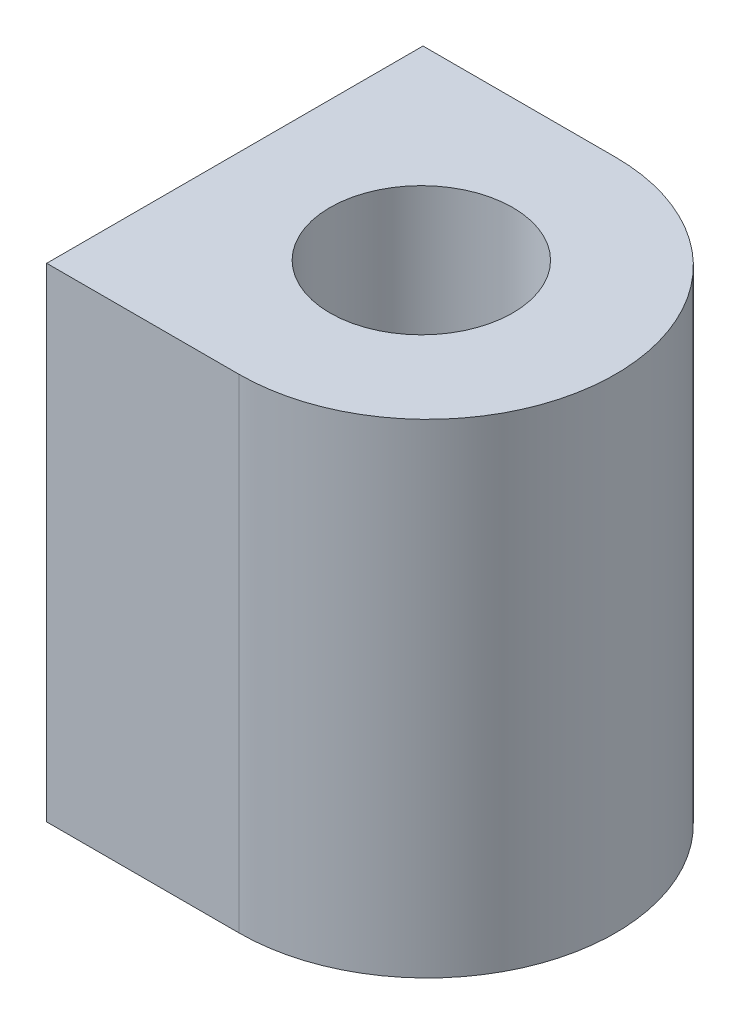
ISO-10303-21;
HEADER;
FILE_DESCRIPTION(('STEP AP214'),'2;1');
FILE_NAME('part.step','',(''),(''),'','','');
FILE_SCHEMA(('AUTOMOTIVE_DESIGN { 1 0 10303 214 1 1 1 1 }'));
ENDSEC;
DATA;
#1=APPLICATION_CONTEXT('core data for automotive mechanical design processes');
#2=APPLICATION_PROTOCOL_DEFINITION('international standard','automotive_design',2000,#1);
#3=PRODUCT_CONTEXT('',#1,'mechanical');
#4=PRODUCT('Part','Part','',(#3));
#5=PRODUCT_RELATED_PRODUCT_CATEGORY('part','',(#4));
#6=PRODUCT_DEFINITION_FORMATION('','',#4);
#7=PRODUCT_DEFINITION_CONTEXT('part definition',#1,'design');
#8=PRODUCT_DEFINITION('design','',#6,#7);
#9=PRODUCT_DEFINITION_SHAPE('','',#8);
#10=(LENGTH_UNIT() NAMED_UNIT(*) SI_UNIT(.MILLI.,.METRE.));
#11=(NAMED_UNIT(*) PLANE_ANGLE_UNIT() SI_UNIT($,.RADIAN.));
#12=(NAMED_UNIT(*) SI_UNIT($,.STERADIAN.) SOLID_ANGLE_UNIT());
#13=UNCERTAINTY_MEASURE_WITH_UNIT(LENGTH_MEASURE(1.E-05),#10,'distance_accuracy_value','');
#14=(GEOMETRIC_REPRESENTATION_CONTEXT(3) GLOBAL_UNCERTAINTY_ASSIGNED_CONTEXT((#13)) GLOBAL_UNIT_ASSIGNED_CONTEXT((#10,
#11,#12)) REPRESENTATION_CONTEXT('',''));
#15=CARTESIAN_POINT('',(0.,0.,0.));
#16=DIRECTION('',(0.,0.,1.));
#17=DIRECTION('',(1.,0.,0.));
#18=AXIS2_PLACEMENT_3D('',#15,#16,#17);
#19=CARTESIAN_POINT('',(0.143666225857325,9.,0.033363683393497));
#20=DIRECTION('',(0.,-1.,0.));
#21=DIRECTION('',(0.,0.,-1.));
#22=AXIS2_PLACEMENT_3D('',#19,#20,#21);
#23=PLANE('',#22);
#24=DIRECTION('',(0.,0.,1.));
#25=VECTOR('',#24,1.);
#26=CARTESIAN_POINT('',(-3.43579487814067,9.,0.033363683393497));
#27=LINE('',#26,#25);
#28=CARTESIAN_POINT('',(-3.43579487814067,9.,-3.4666363166065));
#29=VERTEX_POINT('',#28);
#30=CARTESIAN_POINT('',(-3.43579487814067,9.,3.5333636833935));
#31=VERTEX_POINT('',#30);
#32=EDGE_CURVE('E57',#29,#31,#27,.T.);
#33=ORIENTED_EDGE('',*,*,#32,.T.);
#34=DIRECTION('',(1.,0.,0.));
#35=VECTOR('',#34,1.);
#36=CARTESIAN_POINT('',(-3.43579487814067,9.,3.5333636833935));
#37=LINE('',#36,#35);
#38=CARTESIAN_POINT('',(0.143666225857325,9.,3.5333636833935));
#39=VERTEX_POINT('',#38);
#40=EDGE_CURVE('E88',#31,#39,#37,.T.);
#41=ORIENTED_EDGE('',*,*,#40,.T.);
#42=CARTESIAN_POINT('',(0.143666225857325,9.,0.033363683393497));
#43=DIRECTION('',(0.,1.,0.));
#44=DIRECTION('',(0.,0.,-1.));
#45=AXIS2_PLACEMENT_3D('',#42,#43,#44);
#46=CIRCLE('',#45,3.5);
#47=CARTESIAN_POINT('',(0.143666225857325,9.,-3.4666363166065));
#48=VERTEX_POINT('',#47);
#49=EDGE_CURVE('E92',#39,#48,#46,.T.);
#50=ORIENTED_EDGE('',*,*,#49,.T.);
#51=DIRECTION('',(-1.,0.,0.));
#52=VECTOR('',#51,1.);
#53=CARTESIAN_POINT('',(-3.43579487814067,9.,-3.4666363166065));
#54=LINE('',#53,#52);
#55=EDGE_CURVE('E102',#48,#29,#54,.T.);
#56=ORIENTED_EDGE('',*,*,#55,.T.);
#57=EDGE_LOOP('',(#33,#41,#50,#56));
#58=FACE_BOUND('',#57,.T.);
#59=CARTESIAN_POINT('',(0.,9.,0.));
#60=DIRECTION('',(0.,1.,0.));
#61=DIRECTION('',(0.,0.,1.));
#62=AXIS2_PLACEMENT_3D('',#59,#60,#61);
#63=CIRCLE('',#62,1.7);
#64=CARTESIAN_POINT('',(0.,9.,1.7));
#65=VERTEX_POINT('',#64);
#66=EDGE_CURVE('E111',#65,#65,#63,.T.);
#67=ORIENTED_EDGE('',*,*,#66,.F.);
#68=EDGE_LOOP('',(#67));
#69=FACE_BOUND('',#68,.T.);
#70=ADVANCED_FACE('F39',(#58,#69),#23,.F.);
#71=CARTESIAN_POINT('',(0.143666225857325,0.,0.033363683393497));
#72=DIRECTION('',(0.,-1.,0.));
#73=DIRECTION('',(0.,0.,-1.));
#74=AXIS2_PLACEMENT_3D('',#71,#72,#73);
#75=PLANE('',#74);
#76=DIRECTION('',(1.,0.,0.));
#77=VECTOR('',#76,1.);
#78=CARTESIAN_POINT('',(-3.43579487814067,0.,3.5333636833935));
#79=LINE('',#78,#77);
#80=CARTESIAN_POINT('',(-3.43579487814067,0.,3.5333636833935));
#81=VERTEX_POINT('',#80);
#82=CARTESIAN_POINT('',(0.143666225857325,0.,3.5333636833935));
#83=VERTEX_POINT('',#82);
#84=EDGE_CURVE('E96',#81,#83,#79,.T.);
#85=ORIENTED_EDGE('',*,*,#84,.F.);
#86=DIRECTION('',(0.,0.,1.));
#87=VECTOR('',#86,1.);
#88=CARTESIAN_POINT('',(-3.43579487814067,0.,0.033363683393497));
#89=LINE('',#88,#87);
#90=CARTESIAN_POINT('',(-3.43579487814067,0.,-3.4666363166065));
#91=VERTEX_POINT('',#90);
#92=EDGE_CURVE('E116',#91,#81,#89,.T.);
#93=ORIENTED_EDGE('',*,*,#92,.F.);
#94=DIRECTION('',(-1.,0.,0.));
#95=VECTOR('',#94,1.);
#96=CARTESIAN_POINT('',(-3.43579487814067,0.,-3.4666363166065));
#97=LINE('',#96,#95);
#98=CARTESIAN_POINT('',(0.143666225857325,0.,-3.4666363166065));
#99=VERTEX_POINT('',#98);
#100=EDGE_CURVE('E82',#99,#91,#97,.T.);
#101=ORIENTED_EDGE('',*,*,#100,.F.);
#102=CARTESIAN_POINT('',(0.143666225857325,0.,0.033363683393497));
#103=DIRECTION('',(0.,1.,0.));
#104=DIRECTION('',(0.,0.,-1.));
#105=AXIS2_PLACEMENT_3D('',#102,#103,#104);
#106=CIRCLE('',#105,3.5);
#107=EDGE_CURVE('E75',#83,#99,#106,.T.);
#108=ORIENTED_EDGE('',*,*,#107,.F.);
#109=EDGE_LOOP('',(#85,#93,#101,#108));
#110=FACE_BOUND('',#109,.T.);
#111=CARTESIAN_POINT('',(0.,0.,0.));
#112=DIRECTION('',(0.,1.,0.));
#113=DIRECTION('',(0.,0.,1.));
#114=AXIS2_PLACEMENT_3D('',#111,#112,#113);
#115=CIRCLE('',#114,1.7);
#116=CARTESIAN_POINT('',(0.,0.,1.7));
#117=VERTEX_POINT('',#116);
#118=EDGE_CURVE('E192',#117,#117,#115,.T.);
#119=ORIENTED_EDGE('',*,*,#118,.T.);
#120=EDGE_LOOP('',(#119));
#121=FACE_BOUND('',#120,.T.);
#122=ADVANCED_FACE('F125',(#110,#121),#75,.T.);
#123=CARTESIAN_POINT('',(-3.43579487814067,9.,3.5333636833935));
#124=DIRECTION('',(0.,0.,-1.));
#125=DIRECTION('',(-1.,0.,0.));
#126=AXIS2_PLACEMENT_3D('',#123,#124,#125);
#127=PLANE('',#126);
#128=ORIENTED_EDGE('',*,*,#84,.T.);
#129=DIRECTION('',(0.,-1.,0.));
#130=VECTOR('',#129,1.);
#131=CARTESIAN_POINT('',(0.143666225857325,9.,3.5333636833935));
#132=LINE('',#131,#130);
#133=EDGE_CURVE('E49',#39,#83,#132,.T.);
#134=ORIENTED_EDGE('',*,*,#133,.F.);
#135=ORIENTED_EDGE('',*,*,#40,.F.);
#136=DIRECTION('',(0.,-1.,0.));
#137=VECTOR('',#136,1.);
#138=CARTESIAN_POINT('',(-3.43579487814067,9.,3.5333636833935));
#139=LINE('',#138,#137);
#140=EDGE_CURVE('E11',#31,#81,#139,.T.);
#141=ORIENTED_EDGE('',*,*,#140,.T.);
#142=EDGE_LOOP('',(#128,#134,#135,#141));
#143=FACE_BOUND('',#142,.T.);
#144=ADVANCED_FACE('F41',(#143),#127,.F.);
#145=CARTESIAN_POINT('',(0.143666225857325,9.,0.033363683393497));
#146=DIRECTION('',(0.,-1.,0.));
#147=DIRECTION('',(0.,0.,-1.));
#148=AXIS2_PLACEMENT_3D('',#145,#146,#147);
#149=CYLINDRICAL_SURFACE('',#148,3.5);
#150=ORIENTED_EDGE('',*,*,#107,.T.);
#151=DIRECTION('',(0.,-1.,0.));
#152=VECTOR('',#151,1.);
#153=CARTESIAN_POINT('',(0.143666225857325,9.,-3.4666363166065));
#154=LINE('',#153,#152);
#155=EDGE_CURVE('E98',#48,#99,#154,.T.);
#156=ORIENTED_EDGE('',*,*,#155,.F.);
#157=ORIENTED_EDGE('',*,*,#49,.F.);
#158=ORIENTED_EDGE('',*,*,#133,.T.);
#159=EDGE_LOOP('',(#150,#156,#157,#158));
#160=FACE_BOUND('',#159,.T.);
#161=ADVANCED_FACE('F99',(#160),#149,.T.);
#162=CARTESIAN_POINT('',(-3.43579487814067,9.,-3.4666363166065));
#163=DIRECTION('',(0.,0.,1.));
#164=DIRECTION('',(1.,0.,0.));
#165=AXIS2_PLACEMENT_3D('',#162,#163,#164);
#166=PLANE('',#165);
#167=ORIENTED_EDGE('',*,*,#100,.T.);
#168=DIRECTION('',(0.,-1.,0.));
#169=VECTOR('',#168,1.);
#170=CARTESIAN_POINT('',(-3.43579487814067,9.,-3.4666363166065));
#171=LINE('',#170,#169);
#172=EDGE_CURVE('E105',#29,#91,#171,.T.);
#173=ORIENTED_EDGE('',*,*,#172,.F.);
#174=ORIENTED_EDGE('',*,*,#55,.F.);
#175=ORIENTED_EDGE('',*,*,#155,.T.);
#176=EDGE_LOOP('',(#167,#173,#174,#175));
#177=FACE_BOUND('',#176,.T.);
#178=ADVANCED_FACE('F122',(#177),#166,.F.);
#179=CARTESIAN_POINT('',(-3.43579487814067,9.,0.033363683393497));
#180=DIRECTION('',(1.,0.,0.));
#181=DIRECTION('',(0.,0.,-1.));
#182=AXIS2_PLACEMENT_3D('',#179,#180,#181);
#183=PLANE('',#182);
#184=ORIENTED_EDGE('',*,*,#92,.T.);
#185=ORIENTED_EDGE('',*,*,#140,.F.);
#186=ORIENTED_EDGE('',*,*,#32,.F.);
#187=ORIENTED_EDGE('',*,*,#172,.T.);
#188=EDGE_LOOP('',(#184,#185,#186,#187));
#189=FACE_BOUND('',#188,.T.);
#190=ADVANCED_FACE('F127',(#189),#183,.F.);
#191=CARTESIAN_POINT('',(0.,9.,0.));
#192=DIRECTION('',(0.,-1.,0.));
#193=DIRECTION('',(0.,0.,-1.));
#194=AXIS2_PLACEMENT_3D('',#191,#192,#193);
#195=CYLINDRICAL_SURFACE('',#194,1.7);
#196=ORIENTED_EDGE('',*,*,#66,.T.);
#197=EDGE_LOOP('',(#196));
#198=FACE_BOUND('',#197,.T.);
#199=ORIENTED_EDGE('',*,*,#118,.F.);
#200=EDGE_LOOP('',(#199));
#201=FACE_BOUND('',#200,.T.);
#202=ADVANCED_FACE('F129',(#198,#201),#195,.F.);
#203=CLOSED_SHELL('',(#70,#122,#144,#161,#178,#190,#202));
#204=MANIFOLD_SOLID_BREP('B2',#203);
#205=ADVANCED_BREP_SHAPE_REPRESENTATION('',(#18,#204),#14);
#206=SHAPE_DEFINITION_REPRESENTATION(#9,#205);
ENDSEC;
END-ISO-10303-21;
